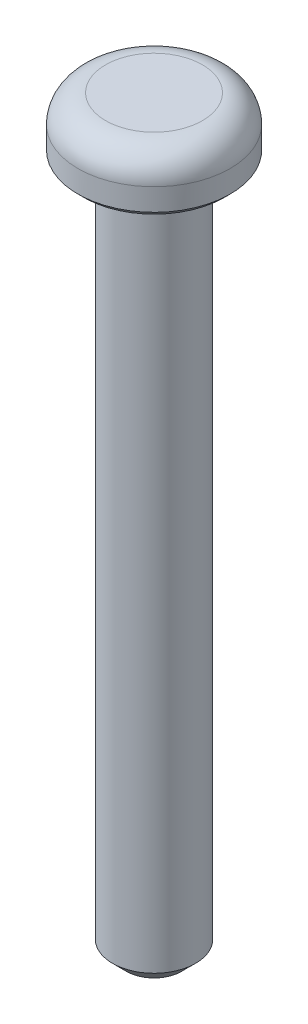
ISO-10303-21;
HEADER;
FILE_DESCRIPTION(('STEP AP214'),'2;1');
FILE_NAME('part.step','',(''),(''),'','','');
FILE_SCHEMA(('AUTOMOTIVE_DESIGN { 1 0 10303 214 1 1 1 1 }'));
ENDSEC;
DATA;
#1=APPLICATION_CONTEXT('core data for automotive mechanical design processes');
#2=APPLICATION_PROTOCOL_DEFINITION('international standard','automotive_design',2000,#1);
#3=PRODUCT_CONTEXT('',#1,'mechanical');
#4=PRODUCT('Part','Part','',(#3));
#5=PRODUCT_RELATED_PRODUCT_CATEGORY('part','',(#4));
#6=PRODUCT_DEFINITION_FORMATION('','',#4);
#7=PRODUCT_DEFINITION_CONTEXT('part definition',#1,'design');
#8=PRODUCT_DEFINITION('design','',#6,#7);
#9=PRODUCT_DEFINITION_SHAPE('','',#8);
#10=(LENGTH_UNIT() NAMED_UNIT(*) SI_UNIT(.MILLI.,.METRE.));
#11=(NAMED_UNIT(*) PLANE_ANGLE_UNIT() SI_UNIT($,.RADIAN.));
#12=(NAMED_UNIT(*) SI_UNIT($,.STERADIAN.) SOLID_ANGLE_UNIT());
#13=UNCERTAINTY_MEASURE_WITH_UNIT(LENGTH_MEASURE(1.E-05),#10,'distance_accuracy_value','');
#14=(GEOMETRIC_REPRESENTATION_CONTEXT(3) GLOBAL_UNCERTAINTY_ASSIGNED_CONTEXT((#13)) GLOBAL_UNIT_ASSIGNED_CONTEXT((#10,
#11,#12)) REPRESENTATION_CONTEXT('',''));
#15=CARTESIAN_POINT('',(0.,0.,0.));
#16=DIRECTION('',(0.,0.,1.));
#17=DIRECTION('',(1.,0.,0.));
#18=AXIS2_PLACEMENT_3D('',#15,#16,#17);
#19=CARTESIAN_POINT('',(1.5,0.,0.));
#20=DIRECTION('',(0.,-1.,0.));
#21=DIRECTION('',(0.,0.,-1.));
#22=AXIS2_PLACEMENT_3D('',#19,#20,#21);
#23=PLANE('',#22);
#24=CARTESIAN_POINT('',(0.,0.,0.));
#25=DIRECTION('',(0.,-1.,0.));
#26=DIRECTION('',(0.,0.,-1.));
#27=AXIS2_PLACEMENT_3D('',#24,#25,#26);
#28=CIRCLE('',#27,1.);
#29=CARTESIAN_POINT('',(0.,0.,-1.));
#30=VERTEX_POINT('',#29);
#31=EDGE_CURVE('E45',#30,#30,#28,.T.);
#32=ORIENTED_EDGE('',*,*,#31,.T.);
#33=EDGE_LOOP('',(#32));
#34=FACE_BOUND('',#33,.T.);
#35=ADVANCED_FACE('F30',(#34),#23,.T.);
#36=CARTESIAN_POINT('',(0.,27.,0.));
#37=DIRECTION('',(0.,1.,0.));
#38=DIRECTION('',(0.,0.,1.));
#39=AXIS2_PLACEMENT_3D('',#36,#37,#38);
#40=PLANE('',#39);
#41=CARTESIAN_POINT('',(0.,27.,0.));
#42=DIRECTION('',(0.,1.,0.));
#43=DIRECTION('',(0.,0.,1.));
#44=AXIS2_PLACEMENT_3D('',#41,#42,#43);
#45=CIRCLE('',#44,1.75);
#46=CARTESIAN_POINT('',(0.,27.,1.75));
#47=VERTEX_POINT('',#46);
#48=EDGE_CURVE('E50',#47,#47,#45,.T.);
#49=ORIENTED_EDGE('',*,*,#48,.T.);
#50=EDGE_LOOP('',(#49));
#51=FACE_BOUND('',#50,.T.);
#52=ADVANCED_FACE('F73',(#51),#40,.T.);
#53=CARTESIAN_POINT('',(0.,0.,0.));
#54=DIRECTION('',(0.,-1.,0.));
#55=DIRECTION('',(0.,0.,-1.));
#56=AXIS2_PLACEMENT_3D('',#53,#54,#55);
#57=CYLINDRICAL_SURFACE('',#56,2.75);
#58=CARTESIAN_POINT('',(0.,25.2,0.));
#59=DIRECTION('',(0.,-1.,0.));
#60=DIRECTION('',(0.,0.,-1.));
#61=AXIS2_PLACEMENT_3D('',#58,#59,#60);
#62=CIRCLE('',#61,2.75);
#63=CARTESIAN_POINT('',(0.,25.2,-2.75));
#64=VERTEX_POINT('',#63);
#65=EDGE_CURVE('E10',#64,#64,#62,.F.);
#66=ORIENTED_EDGE('',*,*,#65,.T.);
#67=EDGE_LOOP('',(#66));
#68=FACE_BOUND('',#67,.T.);
#69=CARTESIAN_POINT('',(0.,26.,0.));
#70=DIRECTION('',(0.,1.,0.));
#71=DIRECTION('',(0.,0.,1.));
#72=AXIS2_PLACEMENT_3D('',#69,#70,#71);
#73=CIRCLE('',#72,2.75);
#74=CARTESIAN_POINT('',(0.,26.,2.75));
#75=VERTEX_POINT('',#74);
#76=EDGE_CURVE('E53',#75,#75,#73,.F.);
#77=ORIENTED_EDGE('',*,*,#76,.T.);
#78=EDGE_LOOP('',(#77));
#79=FACE_BOUND('',#78,.T.);
#80=ADVANCED_FACE('F64',(#68,#79),#57,.T.);
#81=CARTESIAN_POINT('',(2.75,25.,0.));
#82=DIRECTION('',(0.,-1.,0.));
#83=DIRECTION('',(0.,0.,-1.));
#84=AXIS2_PLACEMENT_3D('',#81,#82,#83);
#85=PLANE('',#84);
#86=CARTESIAN_POINT('',(0.,25.,0.));
#87=DIRECTION('',(0.,-1.,0.));
#88=DIRECTION('',(0.,0.,-1.));
#89=AXIS2_PLACEMENT_3D('',#86,#87,#88);
#90=CIRCLE('',#89,2.55);
#91=CARTESIAN_POINT('',(0.,25.,-2.55));
#92=VERTEX_POINT('',#91);
#93=EDGE_CURVE('E37',#92,#92,#90,.T.);
#94=ORIENTED_EDGE('',*,*,#93,.T.);
#95=EDGE_LOOP('',(#94));
#96=FACE_BOUND('',#95,.T.);
#97=CARTESIAN_POINT('',(0.,25.,0.));
#98=DIRECTION('',(0.,-1.,0.));
#99=DIRECTION('',(0.,0.,-1.));
#100=AXIS2_PLACEMENT_3D('',#97,#98,#99);
#101=CIRCLE('',#100,1.5);
#102=CARTESIAN_POINT('',(0.,25.,-1.5));
#103=VERTEX_POINT('',#102);
#104=EDGE_CURVE('E56',#103,#103,#101,.T.);
#105=ORIENTED_EDGE('',*,*,#104,.F.);
#106=EDGE_LOOP('',(#105));
#107=FACE_BOUND('',#106,.T.);
#108=ADVANCED_FACE('F62',(#96,#107),#85,.T.);
#109=CARTESIAN_POINT('',(0.,0.,0.));
#110=DIRECTION('',(0.,-1.,0.));
#111=DIRECTION('',(0.,0.,-1.));
#112=AXIS2_PLACEMENT_3D('',#109,#110,#111);
#113=CYLINDRICAL_SURFACE('',#112,1.5);
#114=CARTESIAN_POINT('',(0.,0.499999999999999,0.));
#115=DIRECTION('',(0.,-1.,0.));
#116=DIRECTION('',(0.,0.,-1.));
#117=AXIS2_PLACEMENT_3D('',#114,#115,#116);
#118=CIRCLE('',#117,1.5);
#119=CARTESIAN_POINT('',(0.,0.499999999999999,-1.5));
#120=VERTEX_POINT('',#119);
#121=EDGE_CURVE('E41',#120,#120,#118,.F.);
#122=ORIENTED_EDGE('',*,*,#121,.T.);
#123=EDGE_LOOP('',(#122));
#124=FACE_BOUND('',#123,.T.);
#125=ORIENTED_EDGE('',*,*,#104,.T.);
#126=EDGE_LOOP('',(#125));
#127=FACE_BOUND('',#126,.T.);
#128=ADVANCED_FACE('F60',(#124,#127),#113,.T.);
#129=CARTESIAN_POINT('',(0.,26.,0.));
#130=DIRECTION('',(0.,1.,0.));
#131=DIRECTION('',(0.,0.,1.));
#132=AXIS2_PLACEMENT_3D('',#129,#130,#131);
#133=TOROIDAL_SURFACE('',#132,1.75,1.);
#134=ORIENTED_EDGE('',*,*,#48,.F.);
#135=EDGE_LOOP('',(#134));
#136=FACE_BOUND('',#135,.T.);
#137=ORIENTED_EDGE('',*,*,#76,.F.);
#138=EDGE_LOOP('',(#137));
#139=FACE_BOUND('',#138,.T.);
#140=ADVANCED_FACE('F70',(#136,#139),#133,.T.);
#141=CARTESIAN_POINT('',(0.,0.,0.));
#142=DIRECTION('',(0.,1.,0.));
#143=DIRECTION('',(0.,0.,1.));
#144=AXIS2_PLACEMENT_3D('',#141,#142,#143);
#145=CONICAL_SURFACE('',#144,1.,0.785398163397447);
#146=ORIENTED_EDGE('',*,*,#121,.F.);
#147=EDGE_LOOP('',(#146));
#148=FACE_BOUND('',#147,.T.);
#149=ORIENTED_EDGE('',*,*,#31,.F.);
#150=EDGE_LOOP('',(#149));
#151=FACE_BOUND('',#150,.T.);
#152=ADVANCED_FACE('F85',(#148,#151),#145,.T.);
#153=CARTESIAN_POINT('',(0.,25.,0.));
#154=DIRECTION('',(0.,1.,0.));
#155=DIRECTION('',(0.,0.,1.));
#156=AXIS2_PLACEMENT_3D('',#153,#154,#155);
#157=CONICAL_SURFACE('',#156,2.55,0.785398163397442);
#158=ORIENTED_EDGE('',*,*,#65,.F.);
#159=EDGE_LOOP('',(#158));
#160=FACE_BOUND('',#159,.T.);
#161=ORIENTED_EDGE('',*,*,#93,.F.);
#162=EDGE_LOOP('',(#161));
#163=FACE_BOUND('',#162,.T.);
#164=ADVANCED_FACE('F32',(#160,#163),#157,.T.);
#165=CLOSED_SHELL('',(#35,#52,#80,#108,#128,#140,#152,#164));
#166=MANIFOLD_SOLID_BREP('B2',#165);
#167=ADVANCED_BREP_SHAPE_REPRESENTATION('',(#18,#166),#14);
#168=SHAPE_DEFINITION_REPRESENTATION(#9,#167);
ENDSEC;
END-ISO-10303-21;
